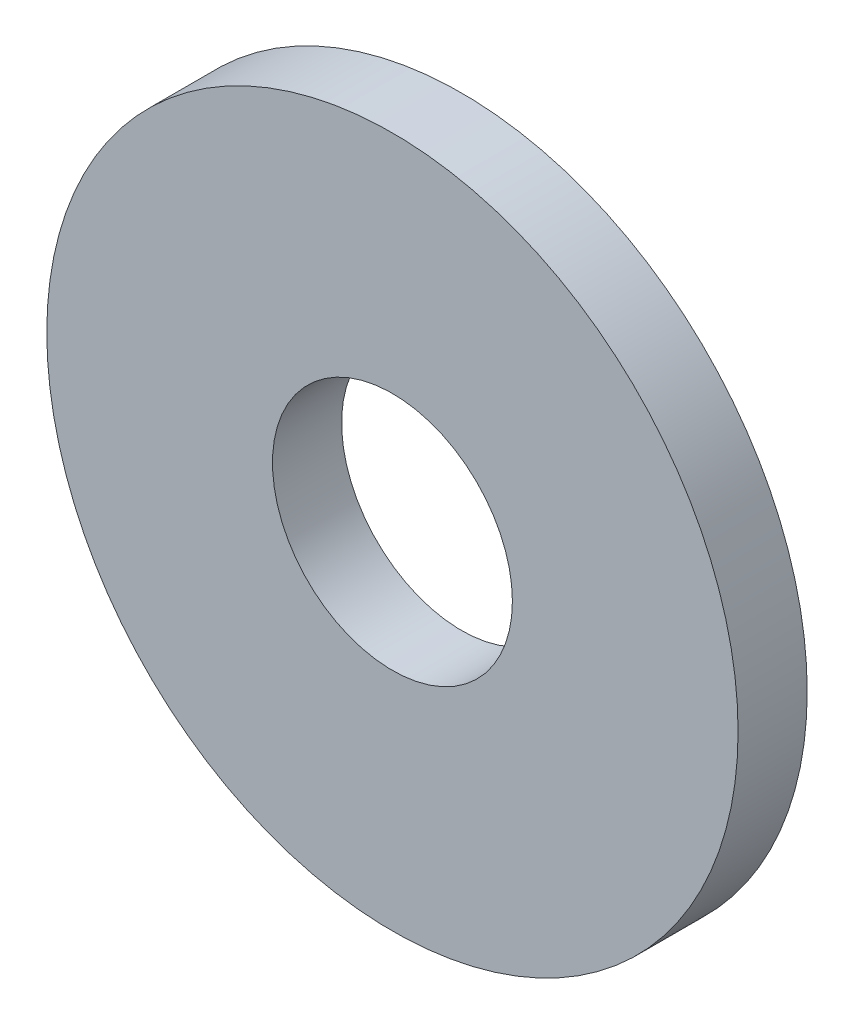
ISO-10303-21;
HEADER;
FILE_DESCRIPTION(('STEP AP214'),'2;1');
FILE_NAME('part.step','',(''),(''),'','','');
FILE_SCHEMA(('AUTOMOTIVE_DESIGN { 1 0 10303 214 1 1 1 1 }'));
ENDSEC;
DATA;
#1=APPLICATION_CONTEXT('core data for automotive mechanical design processes');
#2=APPLICATION_PROTOCOL_DEFINITION('international standard','automotive_design',2000,#1);
#3=PRODUCT_CONTEXT('',#1,'mechanical');
#4=PRODUCT('Part','Part','',(#3));
#5=PRODUCT_RELATED_PRODUCT_CATEGORY('part','',(#4));
#6=PRODUCT_DEFINITION_FORMATION('','',#4);
#7=PRODUCT_DEFINITION_CONTEXT('part definition',#1,'design');
#8=PRODUCT_DEFINITION('design','',#6,#7);
#9=PRODUCT_DEFINITION_SHAPE('','',#8);
#10=(LENGTH_UNIT() NAMED_UNIT(*) SI_UNIT(.MILLI.,.METRE.));
#11=(NAMED_UNIT(*) PLANE_ANGLE_UNIT() SI_UNIT($,.RADIAN.));
#12=(NAMED_UNIT(*) SI_UNIT($,.STERADIAN.) SOLID_ANGLE_UNIT());
#13=UNCERTAINTY_MEASURE_WITH_UNIT(LENGTH_MEASURE(1.E-05),#10,'distance_accuracy_value','');
#14=(GEOMETRIC_REPRESENTATION_CONTEXT(3) GLOBAL_UNCERTAINTY_ASSIGNED_CONTEXT((#13)) GLOBAL_UNIT_ASSIGNED_CONTEXT((#10,
#11,#12)) REPRESENTATION_CONTEXT('',''));
#15=CARTESIAN_POINT('',(0.,0.,0.));
#16=DIRECTION('',(0.,0.,1.));
#17=DIRECTION('',(1.,0.,0.));
#18=AXIS2_PLACEMENT_3D('',#15,#16,#17);
#19=CARTESIAN_POINT('',(0.,0.,1.7));
#20=DIRECTION('',(0.,0.,1.));
#21=DIRECTION('',(1.,0.,0.));
#22=AXIS2_PLACEMENT_3D('',#19,#20,#21);
#23=PLANE('',#22);
#24=CARTESIAN_POINT('',(0.,0.,1.7));
#25=DIRECTION('',(0.,0.,1.));
#26=DIRECTION('',(1.,0.,0.));
#27=AXIS2_PLACEMENT_3D('',#24,#25,#26);
#28=CIRCLE('',#27,8.5);
#29=CARTESIAN_POINT('',(8.5,0.,1.7));
#30=VERTEX_POINT('',#29);
#31=EDGE_CURVE('E10',#30,#30,#28,.T.);
#32=ORIENTED_EDGE('',*,*,#31,.T.);
#33=EDGE_LOOP('',(#32));
#34=FACE_BOUND('',#33,.T.);
#35=CARTESIAN_POINT('',(0.,0.,1.7));
#36=DIRECTION('',(0.,0.,1.));
#37=DIRECTION('',(1.,0.,0.));
#38=AXIS2_PLACEMENT_3D('',#35,#36,#37);
#39=CIRCLE('',#38,2.95);
#40=CARTESIAN_POINT('',(2.95,0.,1.7));
#41=VERTEX_POINT('',#40);
#42=EDGE_CURVE('E42',#41,#41,#39,.T.);
#43=ORIENTED_EDGE('',*,*,#42,.F.);
#44=EDGE_LOOP('',(#43));
#45=FACE_BOUND('',#44,.T.);
#46=ADVANCED_FACE('F31',(#34,#45),#23,.T.);
#47=CARTESIAN_POINT('',(0.,0.,0.));
#48=DIRECTION('',(0.,0.,1.));
#49=DIRECTION('',(1.,0.,0.));
#50=AXIS2_PLACEMENT_3D('',#47,#48,#49);
#51=PLANE('',#50);
#52=CARTESIAN_POINT('',(0.,0.,0.));
#53=DIRECTION('',(0.,0.,1.));
#54=DIRECTION('',(1.,0.,0.));
#55=AXIS2_PLACEMENT_3D('',#52,#53,#54);
#56=CIRCLE('',#55,8.5);
#57=CARTESIAN_POINT('',(8.5,0.,0.));
#58=VERTEX_POINT('',#57);
#59=EDGE_CURVE('E35',#58,#58,#56,.T.);
#60=ORIENTED_EDGE('',*,*,#59,.F.);
#61=EDGE_LOOP('',(#60));
#62=FACE_BOUND('',#61,.T.);
#63=CARTESIAN_POINT('',(0.,0.,0.));
#64=DIRECTION('',(0.,0.,1.));
#65=DIRECTION('',(1.,0.,0.));
#66=AXIS2_PLACEMENT_3D('',#63,#64,#65);
#67=CIRCLE('',#66,2.95);
#68=CARTESIAN_POINT('',(2.95,0.,0.));
#69=VERTEX_POINT('',#68);
#70=EDGE_CURVE('E44',#69,#69,#67,.T.);
#71=ORIENTED_EDGE('',*,*,#70,.T.);
#72=EDGE_LOOP('',(#71));
#73=FACE_BOUND('',#72,.T.);
#74=ADVANCED_FACE('F54',(#62,#73),#51,.F.);
#75=CARTESIAN_POINT('',(0.,0.,1.7));
#76=DIRECTION('',(0.,0.,-1.));
#77=DIRECTION('',(-1.,0.,0.));
#78=AXIS2_PLACEMENT_3D('',#75,#76,#77);
#79=CYLINDRICAL_SURFACE('',#78,8.5);
#80=ORIENTED_EDGE('',*,*,#31,.F.);
#81=EDGE_LOOP('',(#80));
#82=FACE_BOUND('',#81,.T.);
#83=ORIENTED_EDGE('',*,*,#59,.T.);
#84=EDGE_LOOP('',(#83));
#85=FACE_BOUND('',#84,.T.);
#86=ADVANCED_FACE('F33',(#82,#85),#79,.T.);
#87=CARTESIAN_POINT('',(0.,0.,1.7));
#88=DIRECTION('',(0.,0.,-1.));
#89=DIRECTION('',(-1.,0.,0.));
#90=AXIS2_PLACEMENT_3D('',#87,#88,#89);
#91=CYLINDRICAL_SURFACE('',#90,2.95);
#92=ORIENTED_EDGE('',*,*,#42,.T.);
#93=EDGE_LOOP('',(#92));
#94=FACE_BOUND('',#93,.T.);
#95=ORIENTED_EDGE('',*,*,#70,.F.);
#96=EDGE_LOOP('',(#95));
#97=FACE_BOUND('',#96,.T.);
#98=ADVANCED_FACE('F50',(#94,#97),#91,.F.);
#99=CLOSED_SHELL('',(#46,#74,#86,#98));
#100=MANIFOLD_SOLID_BREP('B2',#99);
#101=ADVANCED_BREP_SHAPE_REPRESENTATION('',(#18,#100),#14);
#102=SHAPE_DEFINITION_REPRESENTATION(#9,#101);
ENDSEC;
END-ISO-10303-21;
